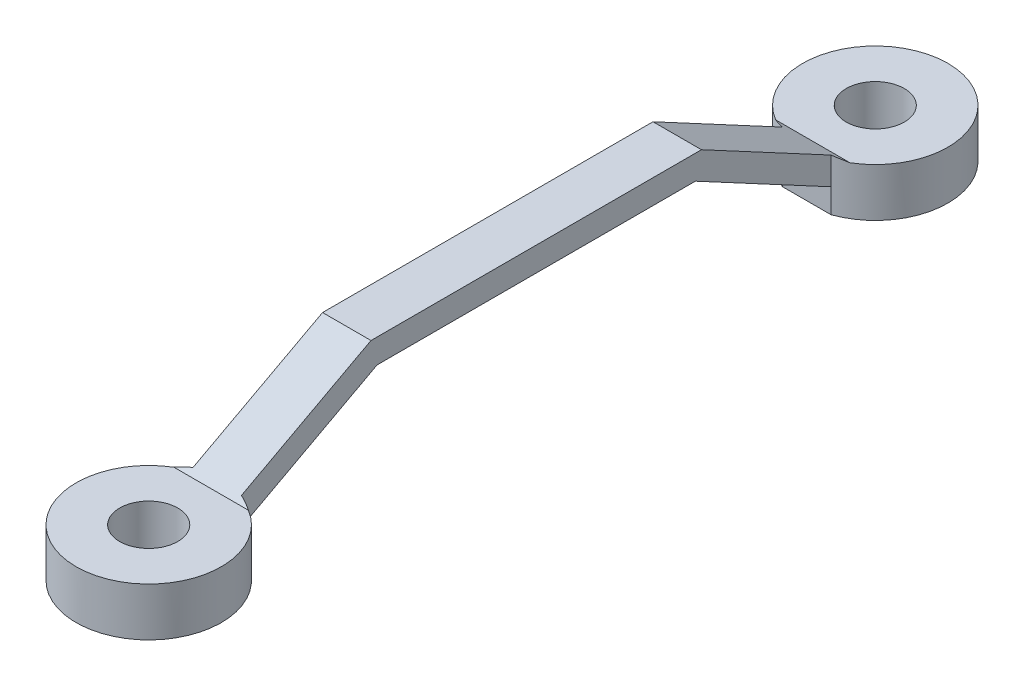
ISO-10303-21;
HEADER;
FILE_DESCRIPTION(('STEP AP214'),'2;1');
FILE_NAME('part.step','',(''),(''),'','','');
FILE_SCHEMA(('AUTOMOTIVE_DESIGN { 1 0 10303 214 1 1 1 1 }'));
ENDSEC;
DATA;
#1=APPLICATION_CONTEXT('core data for automotive mechanical design processes');
#2=APPLICATION_PROTOCOL_DEFINITION('international standard','automotive_design',2000,#1);
#3=PRODUCT_CONTEXT('',#1,'mechanical');
#4=PRODUCT('Part','Part','',(#3));
#5=PRODUCT_RELATED_PRODUCT_CATEGORY('part','',(#4));
#6=PRODUCT_DEFINITION_FORMATION('','',#4);
#7=PRODUCT_DEFINITION_CONTEXT('part definition',#1,'design');
#8=PRODUCT_DEFINITION('design','',#6,#7);
#9=PRODUCT_DEFINITION_SHAPE('','',#8);
#10=(LENGTH_UNIT() NAMED_UNIT(*) SI_UNIT(.MILLI.,.METRE.));
#11=(NAMED_UNIT(*) PLANE_ANGLE_UNIT() SI_UNIT($,.RADIAN.));
#12=(NAMED_UNIT(*) SI_UNIT($,.STERADIAN.) SOLID_ANGLE_UNIT());
#13=UNCERTAINTY_MEASURE_WITH_UNIT(LENGTH_MEASURE(1.E-05),#10,'distance_accuracy_value','');
#14=(GEOMETRIC_REPRESENTATION_CONTEXT(3) GLOBAL_UNCERTAINTY_ASSIGNED_CONTEXT((#13)) GLOBAL_UNIT_ASSIGNED_CONTEXT((#10,
#11,#12)) REPRESENTATION_CONTEXT('',''));
#15=CARTESIAN_POINT('',(0.,0.,0.));
#16=DIRECTION('',(0.,0.,1.));
#17=DIRECTION('',(1.,0.,0.));
#18=AXIS2_PLACEMENT_3D('',#15,#16,#17);
#19=CARTESIAN_POINT('',(1.,10.,-15.));
#20=DIRECTION('',(0.,-1.,0.));
#21=DIRECTION('',(0.,0.,-1.));
#22=AXIS2_PLACEMENT_3D('',#19,#20,#21);
#23=CYLINDRICAL_SURFACE('',#22,3.00000000000001);
#24=CARTESIAN_POINT('',(1.,0.619286951237533,-15.));
#25=DIRECTION('',(0.,0.881489319836104,-0.472203959126649));
#26=DIRECTION('',(0.,-0.472203959126649,-0.881489319836104));
#27=AXIS2_PLACEMENT_3D('',#24,#25,#26);
#28=ELLIPSE('',#27,3.40333108126346,3.00000000000001);
#29=CARTESIAN_POINT('',(-0.535165401644176,2.,-12.4225463748896));
#30=VERTEX_POINT('',#29);
#31=CARTESIAN_POINT('',(0.,2.13444369375449,-12.1715728752538));
#32=VERTEX_POINT('',#31);
#33=EDGE_CURVE('E369',#30,#32,#28,.T.);
#34=ORIENTED_EDGE('',*,*,#33,.F.);
#35=CARTESIAN_POINT('',(1.,2.,-15.));
#36=DIRECTION('',(0.,1.,0.));
#37=DIRECTION('',(0.,0.,1.));
#38=AXIS2_PLACEMENT_3D('',#35,#36,#37);
#39=CIRCLE('',#38,3.00000000000001);
#40=CARTESIAN_POINT('',(2.53516540164418,2.,-12.4225463748896));
#41=VERTEX_POINT('',#40);
#42=EDGE_CURVE('E13',#41,#30,#39,.T.);
#43=ORIENTED_EDGE('',*,*,#42,.F.);
#44=CARTESIAN_POINT('',(2.00000000000001,2.13444369375449,-12.1715728752538));
#45=VERTEX_POINT('',#44);
#46=EDGE_CURVE('E365',#45,#41,#28,.T.);
#47=ORIENTED_EDGE('',*,*,#46,.F.);
#48=DIRECTION('',(0.,-1.,0.));
#49=VECTOR('',#48,1.);
#50=CARTESIAN_POINT('',(2.00000000000001,10.,-12.1715728752538));
#51=LINE('',#50,#49);
#52=CARTESIAN_POINT('',(2.00000000000001,1.,-12.1715728752538));
#53=VERTEX_POINT('',#52);
#54=EDGE_CURVE('E279',#45,#53,#51,.T.);
#55=ORIENTED_EDGE('',*,*,#54,.T.);
#56=DIRECTION('',(0.,1.,0.));
#57=VECTOR('',#56,1.);
#58=CARTESIAN_POINT('',(2.00000000000001,10.,-12.1715728752538));
#59=LINE('',#58,#57);
#60=CARTESIAN_POINT('',(2.,0.,-12.1715728752538));
#61=VERTEX_POINT('',#60);
#62=EDGE_CURVE('E348',#61,#53,#59,.T.);
#63=ORIENTED_EDGE('',*,*,#62,.F.);
#64=CARTESIAN_POINT('',(1.,0.,-15.));
#65=DIRECTION('',(0.,1.,0.));
#66=DIRECTION('',(0.,0.,1.));
#67=AXIS2_PLACEMENT_3D('',#64,#65,#66);
#68=CIRCLE('',#67,3.00000000000001);
#69=CARTESIAN_POINT('',(0.,0.,-12.1715728752538));
#70=VERTEX_POINT('',#69);
#71=EDGE_CURVE('E382',#61,#70,#68,.T.);
#72=ORIENTED_EDGE('',*,*,#71,.T.);
#73=DIRECTION('',(0.,-1.,0.));
#74=VECTOR('',#73,1.);
#75=CARTESIAN_POINT('',(0.,10.,-12.1715728752538));
#76=LINE('',#75,#74);
#77=CARTESIAN_POINT('',(0.,1.,-12.1715728752538));
#78=VERTEX_POINT('',#77);
#79=EDGE_CURVE('E351',#78,#70,#76,.T.);
#80=ORIENTED_EDGE('',*,*,#79,.F.);
#81=DIRECTION('',(0.,-1.,0.));
#82=VECTOR('',#81,1.);
#83=CARTESIAN_POINT('',(0.,10.,-12.1715728752538));
#84=LINE('',#83,#82);
#85=EDGE_CURVE('E284',#32,#78,#84,.T.);
#86=ORIENTED_EDGE('',*,*,#85,.F.);
#87=EDGE_LOOP('',(#34,#43,#47,#55,#63,#72,#80,#86));
#88=FACE_BOUND('',#87,.T.);
#89=ADVANCED_FACE('F154',(#88),#23,.T.);
#90=CARTESIAN_POINT('',(0.,10.,12.1715728752538));
#91=DIRECTION('',(1.,0.,0.));
#92=DIRECTION('',(0.,0.,-1.));
#93=AXIS2_PLACEMENT_3D('',#90,#91,#92);
#94=PLANE('',#93);
#95=DIRECTION('',(0.,0.472203959126649,-0.881489319836105));
#96=VECTOR('',#95,1.);
#97=CARTESIAN_POINT('',(0.,3.00678921113394,8.42538815446362));
#98=LINE('',#97,#96);
#99=CARTESIAN_POINT('',(0.,1.,12.1715728752538));
#100=VERTEX_POINT('',#99);
#101=CARTESIAN_POINT('',(0.,4.,6.57130648951805));
#102=VERTEX_POINT('',#101);
#103=EDGE_CURVE('E379',#100,#102,#98,.T.);
#104=ORIENTED_EDGE('',*,*,#103,.F.);
#105=DIRECTION('',(0.,-1.,0.));
#106=VECTOR('',#105,1.);
#107=CARTESIAN_POINT('',(0.,10.,12.1715728752538));
#108=LINE('',#107,#106);
#109=CARTESIAN_POINT('',(0.,2.13444369375449,12.1715728752538));
#110=VERTEX_POINT('',#109);
#111=EDGE_CURVE('E278',#110,#100,#108,.T.);
#112=ORIENTED_EDGE('',*,*,#111,.F.);
#113=DIRECTION('',(0.,0.472203959126649,-0.881489319836104));
#114=VECTOR('',#113,1.);
#115=CARTESIAN_POINT('',(0.,3.88827853097004,8.89759211359027));
#116=LINE('',#115,#114);
#117=CARTESIAN_POINT('',(0.,5.,6.82227998915385));
#118=VERTEX_POINT('',#117);
#119=EDGE_CURVE('E357',#110,#118,#116,.T.);
#120=ORIENTED_EDGE('',*,*,#119,.T.);
#121=DIRECTION('',(0.,0.,-1.));
#122=VECTOR('',#121,1.);
#123=CARTESIAN_POINT('',(0.,5.,12.1715728752538));
#124=LINE('',#123,#122);
#125=CARTESIAN_POINT('',(0.,5.,-6.82227998915385));
#126=VERTEX_POINT('',#125);
#127=EDGE_CURVE('E361',#118,#126,#124,.T.);
#128=ORIENTED_EDGE('',*,*,#127,.T.);
#129=DIRECTION('',(0.,0.472203959126649,0.881489319836104));
#130=VECTOR('',#129,1.);
#131=CARTESIAN_POINT('',(0.,14.0209363828056,10.0176022750085));
#132=LINE('',#131,#130);
#133=EDGE_CURVE('E368',#32,#126,#132,.T.);
#134=ORIENTED_EDGE('',*,*,#133,.F.);
#135=ORIENTED_EDGE('',*,*,#85,.T.);
#136=DIRECTION('',(0.,0.472203959126649,0.881489319836105));
#137=VECTOR('',#136,1.);
#138=CARTESIAN_POINT('',(0.,13.1394470629695,10.4898062341352));
#139=LINE('',#138,#137);
#140=CARTESIAN_POINT('',(0.,4.,-6.57130648951805));
#141=VERTEX_POINT('',#140);
#142=EDGE_CURVE('E372',#78,#141,#139,.T.);
#143=ORIENTED_EDGE('',*,*,#142,.T.);
#144=DIRECTION('',(0.,0.,-1.));
#145=VECTOR('',#144,1.);
#146=CARTESIAN_POINT('',(0.,4.,12.1715728752538));
#147=LINE('',#146,#145);
#148=EDGE_CURVE('E376',#102,#141,#147,.T.);
#149=ORIENTED_EDGE('',*,*,#148,.F.);
#150=EDGE_LOOP('',(#104,#112,#120,#128,#134,#135,#143,#149));
#151=FACE_BOUND('',#150,.T.);
#152=ADVANCED_FACE('F397',(#151),#94,.F.);
#153=CARTESIAN_POINT('',(2.,10.,12.1715728752538));
#154=DIRECTION('',(-1.,0.,0.));
#155=DIRECTION('',(0.,0.,1.));
#156=AXIS2_PLACEMENT_3D('',#153,#154,#155);
#157=PLANE('',#156);
#158=DIRECTION('',(0.,-0.472203959126649,0.881489319836105));
#159=VECTOR('',#158,1.);
#160=CARTESIAN_POINT('',(2.,3.00678921113394,8.42538815446362));
#161=LINE('',#160,#159);
#162=CARTESIAN_POINT('',(2.,4.,6.57130648951805));
#163=VERTEX_POINT('',#162);
#164=CARTESIAN_POINT('',(2.,1.,12.1715728752538));
#165=VERTEX_POINT('',#164);
#166=EDGE_CURVE('E246',#163,#165,#161,.T.);
#167=ORIENTED_EDGE('',*,*,#166,.F.);
#168=DIRECTION('',(0.,0.,1.));
#169=VECTOR('',#168,1.);
#170=CARTESIAN_POINT('',(2.,4.,12.1715728752538));
#171=LINE('',#170,#169);
#172=CARTESIAN_POINT('',(2.00000000000001,4.,-6.57130648951805));
#173=VERTEX_POINT('',#172);
#174=EDGE_CURVE('E257',#173,#163,#171,.T.);
#175=ORIENTED_EDGE('',*,*,#174,.F.);
#176=DIRECTION('',(0.,-0.472203959126649,-0.881489319836105));
#177=VECTOR('',#176,1.);
#178=CARTESIAN_POINT('',(2.,13.1394470629695,10.4898062341352));
#179=LINE('',#178,#177);
#180=EDGE_CURVE('E307',#173,#53,#179,.T.);
#181=ORIENTED_EDGE('',*,*,#180,.T.);
#182=ORIENTED_EDGE('',*,*,#54,.F.);
#183=DIRECTION('',(0.,-0.472203959126649,-0.881489319836104));
#184=VECTOR('',#183,1.);
#185=CARTESIAN_POINT('',(2.,14.0209363828056,10.0176022750085));
#186=LINE('',#185,#184);
#187=CARTESIAN_POINT('',(2.,5.,-6.82227998915385));
#188=VERTEX_POINT('',#187);
#189=EDGE_CURVE('E304',#188,#45,#186,.T.);
#190=ORIENTED_EDGE('',*,*,#189,.F.);
#191=DIRECTION('',(0.,0.,1.));
#192=VECTOR('',#191,1.);
#193=CARTESIAN_POINT('',(2.,5.,12.1715728752538));
#194=LINE('',#193,#192);
#195=CARTESIAN_POINT('',(2.,5.,6.82227998915385));
#196=VERTEX_POINT('',#195);
#197=EDGE_CURVE('E301',#188,#196,#194,.T.);
#198=ORIENTED_EDGE('',*,*,#197,.T.);
#199=DIRECTION('',(0.,-0.472203959126649,0.881489319836104));
#200=VECTOR('',#199,1.);
#201=CARTESIAN_POINT('',(2.,3.88827853097004,8.89759211359027));
#202=LINE('',#201,#200);
#203=CARTESIAN_POINT('',(2.,2.13444369375449,12.1715728752538));
#204=VERTEX_POINT('',#203);
#205=EDGE_CURVE('E276',#196,#204,#202,.T.);
#206=ORIENTED_EDGE('',*,*,#205,.T.);
#207=DIRECTION('',(0.,-1.,0.));
#208=VECTOR('',#207,1.);
#209=CARTESIAN_POINT('',(2.,10.,12.1715728752538));
#210=LINE('',#209,#208);
#211=EDGE_CURVE('E271',#204,#165,#210,.T.);
#212=ORIENTED_EDGE('',*,*,#211,.T.);
#213=EDGE_LOOP('',(#167,#175,#181,#182,#190,#198,#206,#212));
#214=FACE_BOUND('',#213,.T.);
#215=ADVANCED_FACE('F274',(#214),#157,.F.);
#216=CARTESIAN_POINT('',(1.,0.,-15.));
#217=DIRECTION('',(0.,1.,0.));
#218=DIRECTION('',(0.,0.,1.));
#219=AXIS2_PLACEMENT_3D('',#216,#217,#218);
#220=PLANE('',#219);
#221=CARTESIAN_POINT('',(1.,0.,-15.));
#222=DIRECTION('',(0.,1.,0.));
#223=DIRECTION('',(0.,0.,1.));
#224=AXIS2_PLACEMENT_3D('',#221,#222,#223);
#225=CIRCLE('',#224,1.2);
#226=CARTESIAN_POINT('',(1.,0.,-13.8));
#227=VERTEX_POINT('',#226);
#228=EDGE_CURVE('E266',#227,#227,#225,.T.);
#229=ORIENTED_EDGE('',*,*,#228,.T.);
#230=EDGE_LOOP('',(#229));
#231=FACE_BOUND('',#230,.T.);
#232=DIRECTION('',(1.,0.,0.));
#233=VECTOR('',#232,1.);
#234=CARTESIAN_POINT('',(1.,0.,-12.1715728752538));
#235=LINE('',#234,#233);
#236=EDGE_CURVE('E296',#70,#61,#235,.T.);
#237=ORIENTED_EDGE('',*,*,#236,.F.);
#238=ORIENTED_EDGE('',*,*,#71,.F.);
#239=EDGE_LOOP('',(#237,#238));
#240=FACE_BOUND('',#239,.T.);
#241=ADVANCED_FACE('F406',(#231,#240),#220,.F.);
#242=CARTESIAN_POINT('',(1.,0.,15.));
#243=DIRECTION('',(0.,1.,0.));
#244=DIRECTION('',(0.,0.,1.));
#245=AXIS2_PLACEMENT_3D('',#242,#243,#244);
#246=CIRCLE('',#245,1.2);
#247=CARTESIAN_POINT('',(1.,0.,16.2));
#248=VERTEX_POINT('',#247);
#249=EDGE_CURVE('E652',#248,#248,#246,.T.);
#250=ORIENTED_EDGE('',*,*,#249,.T.);
#251=EDGE_LOOP('',(#250));
#252=FACE_BOUND('',#251,.T.);
#253=DIRECTION('',(-1.,0.,0.));
#254=VECTOR('',#253,1.);
#255=CARTESIAN_POINT('',(0.999999999999999,0.,12.1715728752538));
#256=LINE('',#255,#254);
#257=CARTESIAN_POINT('',(2.,0.,12.1715728752538));
#258=VERTEX_POINT('',#257);
#259=CARTESIAN_POINT('',(0.,0.,12.1715728752538));
#260=VERTEX_POINT('',#259);
#261=EDGE_CURVE('E293',#258,#260,#256,.T.);
#262=ORIENTED_EDGE('',*,*,#261,.F.);
#263=CARTESIAN_POINT('',(1.,0.,15.));
#264=DIRECTION('',(0.,1.,0.));
#265=DIRECTION('',(0.,0.,-1.));
#266=AXIS2_PLACEMENT_3D('',#263,#264,#265);
#267=CIRCLE('',#266,3.);
#268=EDGE_CURVE('E177',#260,#258,#267,.T.);
#269=ORIENTED_EDGE('',*,*,#268,.F.);
#270=EDGE_LOOP('',(#262,#269));
#271=FACE_BOUND('',#270,.T.);
#272=ADVANCED_FACE('F408',(#252,#271),#220,.F.);
#273=CARTESIAN_POINT('',(1.,10.,15.));
#274=DIRECTION('',(0.,-1.,0.));
#275=DIRECTION('',(0.,0.,-1.));
#276=AXIS2_PLACEMENT_3D('',#273,#274,#275);
#277=CYLINDRICAL_SURFACE('',#276,3.);
#278=CARTESIAN_POINT('',(1.,2.,15.));
#279=DIRECTION('',(0.,-1.,0.));
#280=DIRECTION('',(0.,0.,-1.));
#281=AXIS2_PLACEMENT_3D('',#278,#279,#280);
#282=CIRCLE('',#281,3.);
#283=CARTESIAN_POINT('',(2.53516540164418,2.,12.4225463748896));
#284=VERTEX_POINT('',#283);
#285=CARTESIAN_POINT('',(-0.535165401644173,2.,12.4225463748896));
#286=VERTEX_POINT('',#285);
#287=EDGE_CURVE('E162',#284,#286,#282,.T.);
#288=ORIENTED_EDGE('',*,*,#287,.T.);
#289=CARTESIAN_POINT('',(1.,0.619286951237535,15.));
#290=DIRECTION('',(0.,-0.881489319836104,-0.472203959126649));
#291=DIRECTION('',(0.,-0.472203959126649,0.881489319836104));
#292=AXIS2_PLACEMENT_3D('',#289,#290,#291);
#293=ELLIPSE('',#292,3.40333108126346,3.);
#294=EDGE_CURVE('E314',#286,#110,#293,.T.);
#295=ORIENTED_EDGE('',*,*,#294,.T.);
#296=ORIENTED_EDGE('',*,*,#111,.T.);
#297=DIRECTION('',(0.,-1.,0.));
#298=VECTOR('',#297,1.);
#299=CARTESIAN_POINT('',(0.,10.,12.1715728752538));
#300=LINE('',#299,#298);
#301=EDGE_CURVE('E263',#260,#100,#300,.F.);
#302=ORIENTED_EDGE('',*,*,#301,.F.);
#303=ORIENTED_EDGE('',*,*,#268,.T.);
#304=DIRECTION('',(0.,-1.,0.));
#305=VECTOR('',#304,1.);
#306=CARTESIAN_POINT('',(2.,10.,12.1715728752538));
#307=LINE('',#306,#305);
#308=EDGE_CURVE('E261',#165,#258,#307,.T.);
#309=ORIENTED_EDGE('',*,*,#308,.F.);
#310=ORIENTED_EDGE('',*,*,#211,.F.);
#311=EDGE_CURVE('E169',#204,#284,#293,.T.);
#312=ORIENTED_EDGE('',*,*,#311,.T.);
#313=EDGE_LOOP('',(#288,#295,#296,#302,#303,#309,#310,#312));
#314=FACE_BOUND('',#313,.T.);
#315=ADVANCED_FACE('F270',(#314),#277,.T.);
#316=CARTESIAN_POINT('',(4.00000000000001,0.,-12.1715728752538));
#317=DIRECTION('',(0.,0.,1.));
#318=DIRECTION('',(1.,0.,0.));
#319=AXIS2_PLACEMENT_3D('',#316,#317,#318);
#320=PLANE('',#319);
#321=ORIENTED_EDGE('',*,*,#79,.T.);
#322=ORIENTED_EDGE('',*,*,#236,.T.);
#323=ORIENTED_EDGE('',*,*,#62,.T.);
#324=DIRECTION('',(-1.,0.,0.));
#325=VECTOR('',#324,1.);
#326=CARTESIAN_POINT('',(4.00000000000001,1.,-12.1715728752538));
#327=LINE('',#326,#325);
#328=EDGE_CURVE('E336',#53,#78,#327,.T.);
#329=ORIENTED_EDGE('',*,*,#328,.T.);
#330=EDGE_LOOP('',(#321,#322,#323,#329));
#331=FACE_BOUND('',#330,.T.);
#332=ADVANCED_FACE('F403',(#331),#320,.T.);
#333=CARTESIAN_POINT('',(4.00000000000001,5.84335234690291,-3.13021842770889));
#334=DIRECTION('',(0.,0.881489319836104,-0.472203959126649));
#335=DIRECTION('',(0.,0.472203959126649,0.881489319836105));
#336=AXIS2_PLACEMENT_3D('',#333,#334,#335);
#337=PLANE('',#336);
#338=ORIENTED_EDGE('',*,*,#328,.F.);
#339=ORIENTED_EDGE('',*,*,#180,.F.);
#340=DIRECTION('',(-1.,0.,0.));
#341=VECTOR('',#340,1.);
#342=CARTESIAN_POINT('',(4.00000000000001,4.,-6.57130648951805));
#343=LINE('',#342,#341);
#344=EDGE_CURVE('E340',#173,#141,#343,.T.);
#345=ORIENTED_EDGE('',*,*,#344,.T.);
#346=ORIENTED_EDGE('',*,*,#142,.F.);
#347=EDGE_LOOP('',(#338,#339,#345,#346));
#348=FACE_BOUND('',#347,.T.);
#349=ADVANCED_FACE('F430',(#348),#337,.F.);
#350=CARTESIAN_POINT('',(4.00000000000001,4.,0.));
#351=DIRECTION('',(0.,-1.,0.));
#352=DIRECTION('',(0.,0.,-1.));
#353=AXIS2_PLACEMENT_3D('',#350,#351,#352);
#354=PLANE('',#353);
#355=ORIENTED_EDGE('',*,*,#148,.T.);
#356=ORIENTED_EDGE('',*,*,#344,.F.);
#357=ORIENTED_EDGE('',*,*,#174,.T.);
#358=DIRECTION('',(-1.,0.,0.));
#359=VECTOR('',#358,1.);
#360=CARTESIAN_POINT('',(4.00000000000001,4.,6.57130648951805));
#361=LINE('',#360,#359);
#362=EDGE_CURVE('E252',#163,#102,#361,.T.);
#363=ORIENTED_EDGE('',*,*,#362,.T.);
#364=EDGE_LOOP('',(#355,#356,#357,#363));
#365=FACE_BOUND('',#364,.T.);
#366=ADVANCED_FACE('F435',(#365),#354,.T.);
#367=CARTESIAN_POINT('',(4.00000000000001,0.,12.1715728752538));
#368=DIRECTION('',(0.,0.,-1.));
#369=DIRECTION('',(-1.,0.,0.));
#370=AXIS2_PLACEMENT_3D('',#367,#368,#369);
#371=PLANE('',#370);
#372=ORIENTED_EDGE('',*,*,#301,.T.);
#373=DIRECTION('',(-1.,0.,0.));
#374=VECTOR('',#373,1.);
#375=CARTESIAN_POINT('',(4.00000000000001,1.,12.1715728752538));
#376=LINE('',#375,#374);
#377=EDGE_CURVE('E249',#165,#100,#376,.T.);
#378=ORIENTED_EDGE('',*,*,#377,.F.);
#379=ORIENTED_EDGE('',*,*,#308,.T.);
#380=ORIENTED_EDGE('',*,*,#261,.T.);
#381=EDGE_LOOP('',(#372,#378,#379,#380));
#382=FACE_BOUND('',#381,.T.);
#383=ADVANCED_FACE('F260',(#382),#371,.T.);
#384=CARTESIAN_POINT('',(4.00000000000001,5.84335234690291,3.13021842770889));
#385=DIRECTION('',(0.,-0.881489319836104,-0.472203959126649));
#386=DIRECTION('',(0.,0.472203959126649,-0.881489319836105));
#387=AXIS2_PLACEMENT_3D('',#384,#385,#386);
#388=PLANE('',#387);
#389=ORIENTED_EDGE('',*,*,#103,.T.);
#390=ORIENTED_EDGE('',*,*,#362,.F.);
#391=ORIENTED_EDGE('',*,*,#166,.T.);
#392=ORIENTED_EDGE('',*,*,#377,.T.);
#393=EDGE_LOOP('',(#389,#390,#391,#392));
#394=FACE_BOUND('',#393,.T.);
#395=ADVANCED_FACE('F248',(#394),#388,.T.);
#396=CARTESIAN_POINT('',(4.00000000000001,2.,0.));
#397=DIRECTION('',(0.,1.,0.));
#398=DIRECTION('',(0.,0.,1.));
#399=AXIS2_PLACEMENT_3D('',#396,#397,#398);
#400=PLANE('',#399);
#401=CARTESIAN_POINT('',(1.,2.,-15.));
#402=DIRECTION('',(0.,1.,0.));
#403=DIRECTION('',(0.,0.,1.));
#404=AXIS2_PLACEMENT_3D('',#401,#402,#403);
#405=CIRCLE('',#404,1.19999999999999);
#406=CARTESIAN_POINT('',(1.,2.,-13.8));
#407=VERTEX_POINT('',#406);
#408=EDGE_CURVE('E659',#407,#407,#405,.T.);
#409=ORIENTED_EDGE('',*,*,#408,.F.);
#410=EDGE_LOOP('',(#409));
#411=FACE_BOUND('',#410,.T.);
#412=ORIENTED_EDGE('',*,*,#42,.T.);
#413=DIRECTION('',(-1.,0.,0.));
#414=VECTOR('',#413,1.);
#415=CARTESIAN_POINT('',(4.00000000000001,2.,-12.4225463748896));
#416=LINE('',#415,#414);
#417=EDGE_CURVE('E332',#41,#30,#416,.T.);
#418=ORIENTED_EDGE('',*,*,#417,.F.);
#419=EDGE_LOOP('',(#412,#418));
#420=FACE_BOUND('',#419,.T.);
#421=ADVANCED_FACE('F439',(#411,#420),#400,.T.);
#422=CARTESIAN_POINT('',(4.00000000000001,2.,0.));
#423=DIRECTION('',(0.,-1.,0.));
#424=DIRECTION('',(0.,0.,-1.));
#425=AXIS2_PLACEMENT_3D('',#422,#423,#424);
#426=PLANE('',#425);
#427=CARTESIAN_POINT('',(1.,2.,15.));
#428=DIRECTION('',(0.,1.,0.));
#429=DIRECTION('',(0.,0.,1.));
#430=AXIS2_PLACEMENT_3D('',#427,#428,#429);
#431=CIRCLE('',#430,1.19999999999999);
#432=CARTESIAN_POINT('',(1.,2.,16.2));
#433=VERTEX_POINT('',#432);
#434=EDGE_CURVE('E655',#433,#433,#431,.T.);
#435=ORIENTED_EDGE('',*,*,#434,.F.);
#436=EDGE_LOOP('',(#435));
#437=FACE_BOUND('',#436,.T.);
#438=DIRECTION('',(-1.,0.,0.));
#439=VECTOR('',#438,1.);
#440=CARTESIAN_POINT('',(4.00000000000001,2.,12.4225463748896));
#441=LINE('',#440,#439);
#442=EDGE_CURVE('E265',#284,#286,#441,.T.);
#443=ORIENTED_EDGE('',*,*,#442,.T.);
#444=ORIENTED_EDGE('',*,*,#287,.F.);
#445=EDGE_LOOP('',(#443,#444));
#446=FACE_BOUND('',#445,.T.);
#447=ADVANCED_FACE('F318',(#437,#446),#426,.F.);
#448=CARTESIAN_POINT('',(4.00000000000001,6.72484166673901,-3.60242238683554));
#449=DIRECTION('',(0.,0.881489319836104,-0.472203959126649));
#450=DIRECTION('',(0.,0.472203959126649,0.881489319836104));
#451=AXIS2_PLACEMENT_3D('',#448,#449,#450);
#452=PLANE('',#451);
#453=ORIENTED_EDGE('',*,*,#33,.T.);
#454=ORIENTED_EDGE('',*,*,#133,.T.);
#455=DIRECTION('',(-1.,0.,0.));
#456=VECTOR('',#455,1.);
#457=CARTESIAN_POINT('',(4.00000000000001,5.,-6.82227998915385));
#458=LINE('',#457,#456);
#459=EDGE_CURVE('E325',#188,#126,#458,.T.);
#460=ORIENTED_EDGE('',*,*,#459,.F.);
#461=ORIENTED_EDGE('',*,*,#189,.T.);
#462=ORIENTED_EDGE('',*,*,#46,.T.);
#463=ORIENTED_EDGE('',*,*,#417,.T.);
#464=EDGE_LOOP('',(#453,#454,#460,#461,#462,#463));
#465=FACE_BOUND('',#464,.T.);
#466=ADVANCED_FACE('F390',(#465),#452,.T.);
#467=CARTESIAN_POINT('',(4.00000000000001,5.,0.));
#468=DIRECTION('',(0.,-1.,0.));
#469=DIRECTION('',(0.,0.,-1.));
#470=AXIS2_PLACEMENT_3D('',#467,#468,#469);
#471=PLANE('',#470);
#472=DIRECTION('',(-1.,0.,0.));
#473=VECTOR('',#472,1.);
#474=CARTESIAN_POINT('',(4.00000000000001,5.,6.82227998915385));
#475=LINE('',#474,#473);
#476=EDGE_CURVE('E321',#196,#118,#475,.T.);
#477=ORIENTED_EDGE('',*,*,#476,.F.);
#478=ORIENTED_EDGE('',*,*,#197,.F.);
#479=ORIENTED_EDGE('',*,*,#459,.T.);
#480=ORIENTED_EDGE('',*,*,#127,.F.);
#481=EDGE_LOOP('',(#477,#478,#479,#480));
#482=FACE_BOUND('',#481,.T.);
#483=ADVANCED_FACE('F462',(#482),#471,.F.);
#484=CARTESIAN_POINT('',(4.00000000000001,6.72484166673901,3.60242238683554));
#485=DIRECTION('',(0.,-0.881489319836104,-0.472203959126649));
#486=DIRECTION('',(0.,0.472203959126649,-0.881489319836104));
#487=AXIS2_PLACEMENT_3D('',#484,#485,#486);
#488=PLANE('',#487);
#489=ORIENTED_EDGE('',*,*,#294,.F.);
#490=ORIENTED_EDGE('',*,*,#442,.F.);
#491=ORIENTED_EDGE('',*,*,#311,.F.);
#492=ORIENTED_EDGE('',*,*,#205,.F.);
#493=ORIENTED_EDGE('',*,*,#476,.T.);
#494=ORIENTED_EDGE('',*,*,#119,.F.);
#495=EDGE_LOOP('',(#489,#490,#491,#492,#493,#494));
#496=FACE_BOUND('',#495,.T.);
#497=ADVANCED_FACE('F319',(#496),#488,.F.);
#498=CARTESIAN_POINT('',(1.,2.,-15.));
#499=DIRECTION('',(0.,1.,0.));
#500=DIRECTION('',(0.,0.,1.));
#501=AXIS2_PLACEMENT_3D('',#498,#499,#500);
#502=CYLINDRICAL_SURFACE('',#501,1.19999999999999);
#503=ORIENTED_EDGE('',*,*,#228,.F.);
#504=EDGE_LOOP('',(#503));
#505=FACE_BOUND('',#504,.T.);
#506=ORIENTED_EDGE('',*,*,#408,.T.);
#507=EDGE_LOOP('',(#506));
#508=FACE_BOUND('',#507,.T.);
#509=ADVANCED_FACE('F455',(#505,#508),#502,.F.);
#510=CARTESIAN_POINT('',(1.,2.,15.));
#511=DIRECTION('',(0.,1.,0.));
#512=DIRECTION('',(0.,0.,1.));
#513=AXIS2_PLACEMENT_3D('',#510,#511,#512);
#514=CYLINDRICAL_SURFACE('',#513,1.19999999999999);
#515=ORIENTED_EDGE('',*,*,#249,.F.);
#516=EDGE_LOOP('',(#515));
#517=FACE_BOUND('',#516,.T.);
#518=ORIENTED_EDGE('',*,*,#434,.T.);
#519=EDGE_LOOP('',(#518));
#520=FACE_BOUND('',#519,.T.);
#521=ADVANCED_FACE('F484',(#517,#520),#514,.F.);
#522=CLOSED_SHELL('',(#89,#152,#215,#241,#272,#315,#332,#349,#366,#383,#395,#421,#447,#466,#483,
#497,#509,#521));
#523=MANIFOLD_SOLID_BREP('B2',#522);
#524=ADVANCED_BREP_SHAPE_REPRESENTATION('',(#18,#523),#14);
#525=SHAPE_DEFINITION_REPRESENTATION(#9,#524);
ENDSEC;
END-ISO-10303-21;
